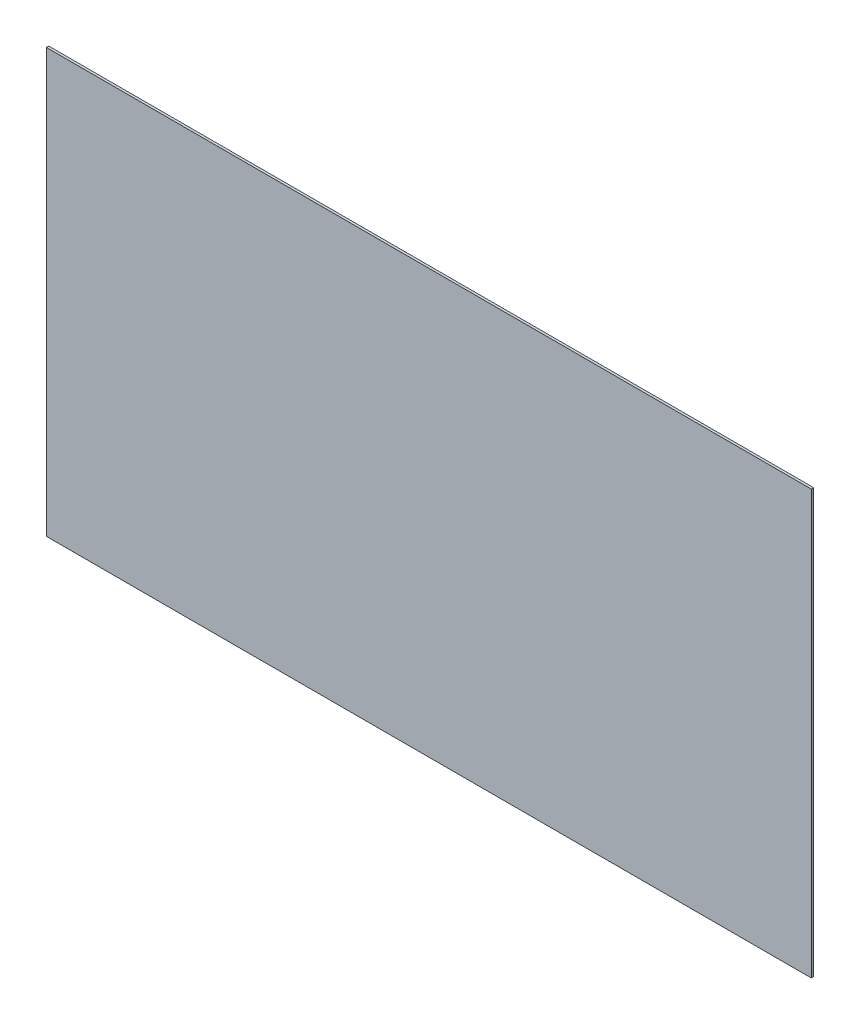
ISO-10303-21;
HEADER;
FILE_DESCRIPTION(('STEP AP214'),'2;1');
FILE_NAME('part.step','',(''),(''),'','','');
FILE_SCHEMA(('AUTOMOTIVE_DESIGN { 1 0 10303 214 1 1 1 1 }'));
ENDSEC;
DATA;
#1=APPLICATION_CONTEXT('core data for automotive mechanical design processes');
#2=APPLICATION_PROTOCOL_DEFINITION('international standard','automotive_design',2000,#1);
#3=PRODUCT_CONTEXT('',#1,'mechanical');
#4=PRODUCT('Part','Part','',(#3));
#5=PRODUCT_RELATED_PRODUCT_CATEGORY('part','',(#4));
#6=PRODUCT_DEFINITION_FORMATION('','',#4);
#7=PRODUCT_DEFINITION_CONTEXT('part definition',#1,'design');
#8=PRODUCT_DEFINITION('design','',#6,#7);
#9=PRODUCT_DEFINITION_SHAPE('','',#8);
#10=(LENGTH_UNIT() NAMED_UNIT(*) SI_UNIT(.MILLI.,.METRE.));
#11=(NAMED_UNIT(*) PLANE_ANGLE_UNIT() SI_UNIT($,.RADIAN.));
#12=(NAMED_UNIT(*) SI_UNIT($,.STERADIAN.) SOLID_ANGLE_UNIT());
#13=UNCERTAINTY_MEASURE_WITH_UNIT(LENGTH_MEASURE(1.E-05),#10,'distance_accuracy_value','');
#14=(GEOMETRIC_REPRESENTATION_CONTEXT(3) GLOBAL_UNCERTAINTY_ASSIGNED_CONTEXT((#13)) GLOBAL_UNIT_ASSIGNED_CONTEXT((#10,
#11,#12)) REPRESENTATION_CONTEXT('',''));
#15=CARTESIAN_POINT('',(0.,0.,0.));
#16=DIRECTION('',(0.,0.,1.));
#17=DIRECTION('',(1.,0.,0.));
#18=AXIS2_PLACEMENT_3D('',#15,#16,#17);
#19=CARTESIAN_POINT('',(504.825,279.4,0.));
#20=DIRECTION('',(1.,0.,0.));
#21=DIRECTION('',(0.,0.,-1.));
#22=AXIS2_PLACEMENT_3D('',#19,#20,#21);
#23=PLANE('',#22);
#24=DIRECTION('',(0.,1.,0.));
#25=VECTOR('',#24,1.);
#26=CARTESIAN_POINT('',(504.825,-279.4,0.));
#27=LINE('',#26,#25);
#28=CARTESIAN_POINT('',(504.825,-279.4,0.));
#29=VERTEX_POINT('',#28);
#30=CARTESIAN_POINT('',(504.825,279.4,0.));
#31=VERTEX_POINT('',#30);
#32=EDGE_CURVE('E34',#29,#31,#27,.T.);
#33=ORIENTED_EDGE('',*,*,#32,.F.);
#34=DIRECTION('',(0.,0.,-1.));
#35=VECTOR('',#34,1.);
#36=CARTESIAN_POINT('',(504.825,-279.4,0.));
#37=LINE('',#36,#35);
#38=CARTESIAN_POINT('',(504.825,-279.4,-3.175));
#39=VERTEX_POINT('',#38);
#40=EDGE_CURVE('E10',#29,#39,#37,.T.);
#41=ORIENTED_EDGE('',*,*,#40,.T.);
#42=DIRECTION('',(0.,-1.,0.));
#43=VECTOR('',#42,1.);
#44=CARTESIAN_POINT('',(504.825,279.4,-3.175));
#45=LINE('',#44,#43);
#46=CARTESIAN_POINT('',(504.825,279.4,-3.175));
#47=VERTEX_POINT('',#46);
#48=EDGE_CURVE('E78',#47,#39,#45,.T.);
#49=ORIENTED_EDGE('',*,*,#48,.F.);
#50=DIRECTION('',(0.,0.,-1.));
#51=VECTOR('',#50,1.);
#52=CARTESIAN_POINT('',(504.825,279.4,0.));
#53=LINE('',#52,#51);
#54=EDGE_CURVE('E26',#31,#47,#53,.T.);
#55=ORIENTED_EDGE('',*,*,#54,.F.);
#56=EDGE_LOOP('',(#33,#41,#49,#55));
#57=FACE_BOUND('',#56,.T.);
#58=ADVANCED_FACE('F16',(#57),#23,.T.);
#59=CARTESIAN_POINT('',(-504.825,279.4,0.));
#60=DIRECTION('',(0.,1.,0.));
#61=DIRECTION('',(0.,0.,1.));
#62=AXIS2_PLACEMENT_3D('',#59,#60,#61);
#63=PLANE('',#62);
#64=DIRECTION('',(-1.,0.,0.));
#65=VECTOR('',#64,1.);
#66=CARTESIAN_POINT('',(504.825,279.4,0.));
#67=LINE('',#66,#65);
#68=CARTESIAN_POINT('',(-504.825,279.4,0.));
#69=VERTEX_POINT('',#68);
#70=EDGE_CURVE('E81',#31,#69,#67,.T.);
#71=ORIENTED_EDGE('',*,*,#70,.F.);
#72=ORIENTED_EDGE('',*,*,#54,.T.);
#73=DIRECTION('',(1.,0.,0.));
#74=VECTOR('',#73,1.);
#75=CARTESIAN_POINT('',(-504.825,279.4,-3.175));
#76=LINE('',#75,#74);
#77=CARTESIAN_POINT('',(-504.825,279.4,-3.175));
#78=VERTEX_POINT('',#77);
#79=EDGE_CURVE('E70',#78,#47,#76,.T.);
#80=ORIENTED_EDGE('',*,*,#79,.F.);
#81=DIRECTION('',(0.,0.,-1.));
#82=VECTOR('',#81,1.);
#83=CARTESIAN_POINT('',(-504.825,279.4,0.));
#84=LINE('',#83,#82);
#85=EDGE_CURVE('E66',#69,#78,#84,.T.);
#86=ORIENTED_EDGE('',*,*,#85,.F.);
#87=EDGE_LOOP('',(#71,#72,#80,#86));
#88=FACE_BOUND('',#87,.T.);
#89=ADVANCED_FACE('F90',(#88),#63,.T.);
#90=CARTESIAN_POINT('',(-504.825,-279.4,0.));
#91=DIRECTION('',(-1.,0.,0.));
#92=DIRECTION('',(0.,0.,1.));
#93=AXIS2_PLACEMENT_3D('',#90,#91,#92);
#94=PLANE('',#93);
#95=DIRECTION('',(0.,-1.,0.));
#96=VECTOR('',#95,1.);
#97=CARTESIAN_POINT('',(-504.825,279.4,0.));
#98=LINE('',#97,#96);
#99=CARTESIAN_POINT('',(-504.825,-279.4,0.));
#100=VERTEX_POINT('',#99);
#101=EDGE_CURVE('E54',#69,#100,#98,.T.);
#102=ORIENTED_EDGE('',*,*,#101,.F.);
#103=ORIENTED_EDGE('',*,*,#85,.T.);
#104=DIRECTION('',(0.,1.,0.));
#105=VECTOR('',#104,1.);
#106=CARTESIAN_POINT('',(-504.825,-279.4,-3.175));
#107=LINE('',#106,#105);
#108=CARTESIAN_POINT('',(-504.825,-279.4,-3.175));
#109=VERTEX_POINT('',#108);
#110=EDGE_CURVE('E60',#109,#78,#107,.T.);
#111=ORIENTED_EDGE('',*,*,#110,.F.);
#112=DIRECTION('',(0.,0.,-1.));
#113=VECTOR('',#112,1.);
#114=CARTESIAN_POINT('',(-504.825,-279.4,0.));
#115=LINE('',#114,#113);
#116=EDGE_CURVE('E63',#100,#109,#115,.T.);
#117=ORIENTED_EDGE('',*,*,#116,.F.);
#118=EDGE_LOOP('',(#102,#103,#111,#117));
#119=FACE_BOUND('',#118,.T.);
#120=ADVANCED_FACE('F62',(#119),#94,.T.);
#121=CARTESIAN_POINT('',(504.825,-279.4,0.));
#122=DIRECTION('',(0.,-1.,0.));
#123=DIRECTION('',(0.,0.,-1.));
#124=AXIS2_PLACEMENT_3D('',#121,#122,#123);
#125=PLANE('',#124);
#126=DIRECTION('',(1.,0.,0.));
#127=VECTOR('',#126,1.);
#128=CARTESIAN_POINT('',(-504.825,-279.4,0.));
#129=LINE('',#128,#127);
#130=EDGE_CURVE('E75',#100,#29,#129,.T.);
#131=ORIENTED_EDGE('',*,*,#130,.F.);
#132=ORIENTED_EDGE('',*,*,#116,.T.);
#133=DIRECTION('',(-1.,0.,0.));
#134=VECTOR('',#133,1.);
#135=CARTESIAN_POINT('',(504.825,-279.4,-3.175));
#136=LINE('',#135,#134);
#137=EDGE_CURVE('E20',#39,#109,#136,.T.);
#138=ORIENTED_EDGE('',*,*,#137,.F.);
#139=ORIENTED_EDGE('',*,*,#40,.F.);
#140=EDGE_LOOP('',(#131,#132,#138,#139));
#141=FACE_BOUND('',#140,.T.);
#142=ADVANCED_FACE('F74',(#141),#125,.T.);
#143=CARTESIAN_POINT('',(0.,0.,-3.175));
#144=DIRECTION('',(0.,0.,1.));
#145=DIRECTION('',(1.,0.,0.));
#146=AXIS2_PLACEMENT_3D('',#143,#144,#145);
#147=PLANE('',#146);
#148=ORIENTED_EDGE('',*,*,#137,.T.);
#149=ORIENTED_EDGE('',*,*,#110,.T.);
#150=ORIENTED_EDGE('',*,*,#79,.T.);
#151=ORIENTED_EDGE('',*,*,#48,.T.);
#152=EDGE_LOOP('',(#148,#149,#150,#151));
#153=FACE_BOUND('',#152,.T.);
#154=ADVANCED_FACE('F77',(#153),#147,.F.);
#155=CARTESIAN_POINT('',(0.,0.,0.));
#156=DIRECTION('',(0.,0.,1.));
#157=DIRECTION('',(1.,0.,0.));
#158=AXIS2_PLACEMENT_3D('',#155,#156,#157);
#159=PLANE('',#158);
#160=ORIENTED_EDGE('',*,*,#130,.T.);
#161=ORIENTED_EDGE('',*,*,#32,.T.);
#162=ORIENTED_EDGE('',*,*,#70,.T.);
#163=ORIENTED_EDGE('',*,*,#101,.T.);
#164=EDGE_LOOP('',(#160,#161,#162,#163));
#165=FACE_BOUND('',#164,.T.);
#166=ADVANCED_FACE('F18',(#165),#159,.T.);
#167=CLOSED_SHELL('',(#58,#89,#120,#142,#154,#166));
#168=MANIFOLD_SOLID_BREP('B1',#167);
#169=ADVANCED_BREP_SHAPE_REPRESENTATION('',(#18,#168),#14);
#170=SHAPE_DEFINITION_REPRESENTATION(#9,#169);
ENDSEC;
END-ISO-10303-21;
